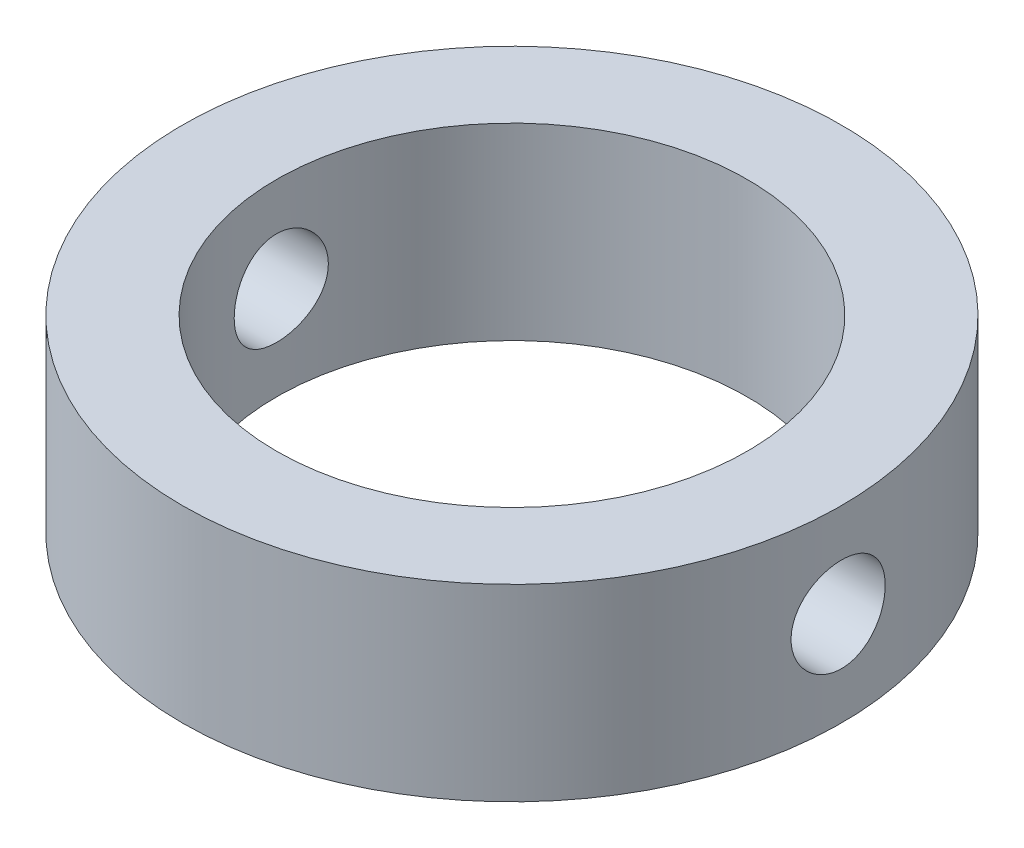
ISO-10303-21;
HEADER;
FILE_DESCRIPTION(('STEP AP214'),'2;1');
FILE_NAME('part.step','',(''),(''),'','','');
FILE_SCHEMA(('AUTOMOTIVE_DESIGN { 1 0 10303 214 1 1 1 1 }'));
ENDSEC;
DATA;
#1=APPLICATION_CONTEXT('core data for automotive mechanical design processes');
#2=APPLICATION_PROTOCOL_DEFINITION('international standard','automotive_design',2000,#1);
#3=PRODUCT_CONTEXT('',#1,'mechanical');
#4=PRODUCT('Part','Part','',(#3));
#5=PRODUCT_RELATED_PRODUCT_CATEGORY('part','',(#4));
#6=PRODUCT_DEFINITION_FORMATION('','',#4);
#7=PRODUCT_DEFINITION_CONTEXT('part definition',#1,'design');
#8=PRODUCT_DEFINITION('design','',#6,#7);
#9=PRODUCT_DEFINITION_SHAPE('','',#8);
#10=(LENGTH_UNIT() NAMED_UNIT(*) SI_UNIT(.MILLI.,.METRE.));
#11=(NAMED_UNIT(*) PLANE_ANGLE_UNIT() SI_UNIT($,.RADIAN.));
#12=(NAMED_UNIT(*) SI_UNIT($,.STERADIAN.) SOLID_ANGLE_UNIT());
#13=UNCERTAINTY_MEASURE_WITH_UNIT(LENGTH_MEASURE(1.E-05),#10,'distance_accuracy_value','');
#14=(GEOMETRIC_REPRESENTATION_CONTEXT(3) GLOBAL_UNCERTAINTY_ASSIGNED_CONTEXT((#13)) GLOBAL_UNIT_ASSIGNED_CONTEXT((#10,
#11,#12)) REPRESENTATION_CONTEXT('',''));
#15=CARTESIAN_POINT('',(0.,0.,0.));
#16=DIRECTION('',(0.,0.,1.));
#17=DIRECTION('',(1.,0.,0.));
#18=AXIS2_PLACEMENT_3D('',#15,#16,#17);
#19=CARTESIAN_POINT('',(0.,20.,0.));
#20=DIRECTION('',(0.,1.,0.));
#21=DIRECTION('',(0.,0.,1.));
#22=AXIS2_PLACEMENT_3D('',#19,#20,#21);
#23=PLANE('',#22);
#24=CARTESIAN_POINT('',(0.,20.,0.));
#25=DIRECTION('',(0.,1.,0.));
#26=DIRECTION('',(0.,0.,1.));
#27=AXIS2_PLACEMENT_3D('',#24,#25,#26);
#28=CIRCLE('',#27,35.);
#29=CARTESIAN_POINT('',(0.,20.,35.));
#30=VERTEX_POINT('',#29);
#31=EDGE_CURVE('E12',#30,#30,#28,.T.);
#32=ORIENTED_EDGE('',*,*,#31,.T.);
#33=EDGE_LOOP('',(#32));
#34=FACE_BOUND('',#33,.T.);
#35=CARTESIAN_POINT('',(0.,20.,0.));
#36=DIRECTION('',(0.,1.,0.));
#37=DIRECTION('',(0.,0.,1.));
#38=AXIS2_PLACEMENT_3D('',#35,#36,#37);
#39=CIRCLE('',#38,25.);
#40=CARTESIAN_POINT('',(0.,20.,25.));
#41=VERTEX_POINT('',#40);
#42=EDGE_CURVE('E62',#41,#41,#39,.T.);
#43=ORIENTED_EDGE('',*,*,#42,.F.);
#44=EDGE_LOOP('',(#43));
#45=FACE_BOUND('',#44,.T.);
#46=ADVANCED_FACE('F44',(#34,#45),#23,.T.);
#47=CARTESIAN_POINT('',(0.,0.,0.));
#48=DIRECTION('',(0.,1.,0.));
#49=DIRECTION('',(0.,0.,1.));
#50=AXIS2_PLACEMENT_3D('',#47,#48,#49);
#51=PLANE('',#50);
#52=CARTESIAN_POINT('',(0.,0.,0.));
#53=DIRECTION('',(0.,1.,0.));
#54=DIRECTION('',(0.,0.,1.));
#55=AXIS2_PLACEMENT_3D('',#52,#53,#54);
#56=CIRCLE('',#55,35.);
#57=CARTESIAN_POINT('',(0.,0.,35.));
#58=VERTEX_POINT('',#57);
#59=EDGE_CURVE('E57',#58,#58,#56,.T.);
#60=ORIENTED_EDGE('',*,*,#59,.F.);
#61=EDGE_LOOP('',(#60));
#62=FACE_BOUND('',#61,.T.);
#63=CARTESIAN_POINT('',(0.,0.,0.));
#64=DIRECTION('',(0.,1.,0.));
#65=DIRECTION('',(0.,0.,1.));
#66=AXIS2_PLACEMENT_3D('',#63,#64,#65);
#67=CIRCLE('',#66,25.);
#68=CARTESIAN_POINT('',(0.,0.,25.));
#69=VERTEX_POINT('',#68);
#70=EDGE_CURVE('E65',#69,#69,#67,.T.);
#71=ORIENTED_EDGE('',*,*,#70,.T.);
#72=EDGE_LOOP('',(#71));
#73=FACE_BOUND('',#72,.T.);
#74=ADVANCED_FACE('F98',(#62,#73),#51,.F.);
#75=CARTESIAN_POINT('',(0.,20.,0.));
#76=DIRECTION('',(0.,-1.,0.));
#77=DIRECTION('',(0.,0.,-1.));
#78=AXIS2_PLACEMENT_3D('',#75,#76,#77);
#79=CYLINDRICAL_SURFACE('',#78,35.);
#80=CARTESIAN_POINT('',(-35.,5.,0.));
#81=CARTESIAN_POINT('',(-35.0000006860778,4.99999818929188,-0.139711965235696));
#82=CARTESIAN_POINT('',(-34.999161843125,5.0058578151773,-0.279398196753226));
#83=CARTESIAN_POINT('',(-34.9958313784779,5.02925000801078,-0.557813784721073));
#84=CARTESIAN_POINT('',(-34.9933394007628,5.04678508940111,-0.696542928547854));
#85=CARTESIAN_POINT('',(-34.9867693707623,5.0934165531225,-0.972102139757613));
#86=CARTESIAN_POINT('',(-34.9826902085511,5.12252102629568,-1.10893080862606));
#87=CARTESIAN_POINT('',(-34.9730590791279,5.19208489808497,-1.37967153042048));
#88=CARTESIAN_POINT('',(-34.967506572113,5.23254845875035,-1.51358249486203));
#89=CARTESIAN_POINT('',(-34.9550920980501,5.32447506158359,-1.7773437010832));
#90=CARTESIAN_POINT('',(-34.9482315879302,5.37592587311224,-1.90719827555243));
#91=CARTESIAN_POINT('',(-34.9333858561535,5.4894993365725,-2.16214361261762));
#92=CARTESIAN_POINT('',(-34.9254002203592,5.55162591991152,-2.28723259945559));
#93=CARTESIAN_POINT('',(-34.9085328812956,5.68605632465839,-2.53166639908102));
#94=CARTESIAN_POINT('',(-34.8996516526061,5.75835476388654,-2.65101420514071));
#95=CARTESIAN_POINT('',(-34.8812325486413,5.91267171554836,-2.88326082385479));
#96=CARTESIAN_POINT('',(-34.8716944304009,5.99469383267839,-2.99615722175638));
#97=CARTESIAN_POINT('',(-34.8521704775311,6.1683847096467,-3.21533718478548));
#98=CARTESIAN_POINT('',(-34.8421823026048,6.2601083282132,-3.3215770714854));
#99=CARTESIAN_POINT('',(-34.8220884461062,6.45218840203753,-3.52600506054429));
#100=CARTESIAN_POINT('',(-34.8119827224244,6.55254803883758,-3.62419016924665));
#101=CARTESIAN_POINT('',(-34.7919447938239,6.76114314216352,-3.81175458438146));
#102=CARTESIAN_POINT('',(-34.7820125357508,6.86937614164711,-3.90113662868194));
#103=CARTESIAN_POINT('',(-34.7625949602833,7.09303892925481,-4.07053623382577));
#104=CARTESIAN_POINT('',(-34.7531098091014,7.20847135730178,-4.15055032826988));
#105=CARTESIAN_POINT('',(-34.7348222414193,7.4461847947123,-4.30091696829763));
#106=CARTESIAN_POINT('',(-34.7260227770465,7.56849189214748,-4.37122864509177));
#107=CARTESIAN_POINT('',(-34.7094000721106,7.81870567941545,-4.50131629768271));
#108=CARTESIAN_POINT('',(-34.7015771956237,7.94661443370769,-4.56108834766626));
#109=CARTESIAN_POINT('',(-34.6871419356038,8.20704411166183,-4.66960271135163));
#110=CARTESIAN_POINT('',(-34.6805290584372,8.33956312813478,-4.7183495248549));
#111=CARTESIAN_POINT('',(-34.6686991206471,8.60831481028371,-4.80449411280179));
#112=CARTESIAN_POINT('',(-34.6634825715625,8.74454881684625,-4.84188772872159));
#113=CARTESIAN_POINT('',(-34.6502412093486,9.15539122224089,-4.93609300727224));
#114=CARTESIAN_POINT('',(-34.6445057193659,9.43422105377913,-4.97579308637068));
#115=CARTESIAN_POINT('',(-34.6398819492284,9.99448707081467,-5.00787485589865));
#116=CARTESIAN_POINT('',(-34.6409933119183,10.275923119598,-5.0002590144896));
#117=CARTESIAN_POINT('',(-34.6498870154908,10.8313714520891,-4.9382471005116));
#118=CARTESIAN_POINT('',(-34.6576192499146,11.1054235888147,-4.88420238946514));
#119=CARTESIAN_POINT('',(-34.6788083896617,11.6405184529141,-4.73139963561513));
#120=CARTESIAN_POINT('',(-34.692265443089,11.9015608435235,-4.63264043601932));
#121=CARTESIAN_POINT('',(-34.723442939239,12.404315551672,-4.39284733162306));
#122=CARTESIAN_POINT('',(-34.741178468128,12.645955343782,-4.25166339197206));
#123=CARTESIAN_POINT('',(-34.7789036804371,13.1022462791065,-3.93113430221592));
#124=CARTESIAN_POINT('',(-34.798893498191,13.3168958123487,-3.75178687737028));
#125=CARTESIAN_POINT('',(-34.8390967878415,13.7151519563424,-3.35808727358497));
#126=CARTESIAN_POINT('',(-34.8593106452498,13.8984597094344,-3.14343268253193));
#127=CARTESIAN_POINT('',(-34.8975158937566,14.2264925219817,-2.68624580236059));
#128=CARTESIAN_POINT('',(-34.9155072766877,14.3712174396505,-2.44371341079993));
#129=CARTESIAN_POINT('',(-34.9472567659471,14.6179871832637,-1.93740519763101));
#130=CARTESIAN_POINT('',(-34.9610127153715,14.7200102726818,-1.67361863827555));
#131=CARTESIAN_POINT('',(-34.9827229972304,14.8782273476525,-1.13241674727819));
#132=CARTESIAN_POINT('',(-34.9906776850993,14.9344241409372,-0.855002251710928));
#133=CARTESIAN_POINT('',(-34.9998423643269,14.9989990670683,-0.297000055843298));
#134=CARTESIAN_POINT('',(-35.0011103405764,15.0077883172752,-0.0164608487179037));
#135=CARTESIAN_POINT('',(-34.9969161817281,14.9783879788458,0.542087125645167));
#136=CARTESIAN_POINT('',(-34.9914542350836,14.9401997056888,0.820095963519429));
#137=CARTESIAN_POINT('',(-34.9744498431576,14.8182701503926,1.3644560453801));
#138=CARTESIAN_POINT('',(-34.9629339676888,14.7347278684361,1.63085276383533));
#139=CARTESIAN_POINT('',(-34.9351093573742,14.5246706353757,2.14585735852662));
#140=CARTESIAN_POINT('',(-34.9188004158195,14.3981538308876,2.39446446698114));
#141=CARTESIAN_POINT('',(-34.8830594271557,14.104765519102,2.8686492452542));
#142=CARTESIAN_POINT('',(-34.8636073633022,13.9376316562326,3.09406305330408));
#143=CARTESIAN_POINT('',(-34.8238111686978,13.568119579361,3.51378821545187));
#144=CARTESIAN_POINT('',(-34.8034669912002,13.3657395168079,3.70809793721321));
#145=CARTESIAN_POINT('',(-34.7639969744239,12.9296591145285,4.06158419660657));
#146=CARTESIAN_POINT('',(-34.744881427038,12.6957350710407,4.22048605580271));
#147=CARTESIAN_POINT('',(-34.7102118986922,12.2042637867791,4.49673891517369));
#148=CARTESIAN_POINT('',(-34.6946578287042,11.9467171367361,4.6140909540289));
#149=CARTESIAN_POINT('',(-34.6689438410495,11.4162038186821,4.80348639883543));
#150=CARTESIAN_POINT('',(-34.6587663611732,11.1432906178735,4.87567746367888));
#151=CARTESIAN_POINT('',(-34.6449167798224,10.5889035851804,4.97315511988575));
#152=CARTESIAN_POINT('',(-34.6412442742826,10.3074302861229,4.99844462460795));
#153=CARTESIAN_POINT('',(-34.6409177443896,9.88660340048782,5.00066933047666));
#154=CARTESIAN_POINT('',(-34.6416592306475,9.74712233687898,4.99555150672416));
#155=CARTESIAN_POINT('',(-34.6448062249864,9.46910768196229,4.97368641015655));
#156=CARTESIAN_POINT('',(-34.64721111119,9.33057375609876,4.95694348348537));
#157=CARTESIAN_POINT('',(-34.6536195165195,9.05538610632109,4.91194067050613));
#158=CARTESIAN_POINT('',(-34.6576236130464,8.91873307996746,4.88367662437867));
#159=CARTESIAN_POINT('',(-34.6671124474975,8.64836127716213,4.81585790764448));
#160=CARTESIAN_POINT('',(-34.6725966491112,8.51464145681404,4.77630732637378));
#161=CARTESIAN_POINT('',(-34.6848879936517,8.25106171539306,4.68621474918535));
#162=CARTESIAN_POINT('',(-34.6916947799399,8.12120076462486,4.6356757158975));
#163=CARTESIAN_POINT('',(-34.706436093274,7.86624784074538,4.52398755892089));
#164=CARTESIAN_POINT('',(-34.7143702129374,7.74115416551156,4.46284226624334));
#165=CARTESIAN_POINT('',(-34.7311475419236,7.49650017972462,4.33034054019654));
#166=CARTESIAN_POINT('',(-34.7399910934,7.37694197648466,4.2589802596769));
#167=CARTESIAN_POINT('',(-34.7583336850593,7.14426737133224,4.1065952131632));
#168=CARTESIAN_POINT('',(-34.7678324910584,7.03114869408639,4.02557389249735));
#169=CARTESIAN_POINT('',(-34.7873123719355,6.81107752456893,3.853628075488));
#170=CARTESIAN_POINT('',(-34.7972970484689,6.70419050143055,3.76262018038959));
#171=CARTESIAN_POINT('',(-34.8173823591155,6.49848730385439,3.57198348876703));
#172=CARTESIAN_POINT('',(-34.8274829501354,6.39966823422946,3.47235781140242));
#173=CARTESIAN_POINT('',(-34.8475259991844,6.21068548934781,3.2650844270276));
#174=CARTESIAN_POINT('',(-34.8574683585998,6.12052704793255,3.15743193813457));
#175=CARTESIAN_POINT('',(-34.8769059739469,5.94959504947742,2.93494333367632));
#176=CARTESIAN_POINT('',(-34.8864013936703,5.86881803821249,2.82010988623894));
#177=CARTESIAN_POINT('',(-34.9047316512703,5.71677456207878,2.58338423045614));
#178=CARTESIAN_POINT('',(-34.9135626772856,5.64556137187799,2.46145749893787));
#179=CARTESIAN_POINT('',(-34.9302535606849,5.51369959328609,2.21201372916546));
#180=CARTESIAN_POINT('',(-34.9381137745068,5.45304712410902,2.08449876609138));
#181=CARTESIAN_POINT('',(-34.9526376335039,5.34276185965578,1.82483209134307));
#182=CARTESIAN_POINT('',(-34.9593021712943,5.29312083733788,1.69268392736855));
#183=CARTESIAN_POINT('',(-34.9712506726184,5.20518346886345,1.42465130322803));
#184=CARTESIAN_POINT('',(-34.9765349502521,5.1668845413667,1.28876770091337));
#185=CARTESIAN_POINT('',(-34.9872530233497,5.08982078578532,0.963108594661556));
#186=CARTESIAN_POINT('',(-34.9920122459541,5.05617470132987,0.772076120040924));
#187=CARTESIAN_POINT('',(-34.9983852418966,5.01126568365557,0.387345931764564));
#188=CARTESIAN_POINT('',(-34.9999990490595,5.00000250973818,0.193648246792198));
#189=CARTESIAN_POINT('',(-35.,5.,0.));
#190=B_SPLINE_CURVE_WITH_KNOTS('',3,(#80,#81,#82,#83,#84,#85,#86,#87,#88,#89,#90,#91,#92,#93,
#94,#95,#96,#97,#98,#99,#100,#101,#102,#103,#104,#105,#106,#107,#108,#109,#110,#111,#112,#113,
#114,#115,#116,#117,#118,#119,#120,#121,#122,#123,#124,#125,#126,#127,#128,#129,#130,#131,#132,
#133,#134,#135,#136,#137,#138,#139,#140,#141,#142,#143,#144,#145,#146,#147,#148,#149,#150,#151,
#152,#153,#154,#155,#156,#157,#158,#159,#160,#161,#162,#163,#164,#165,#166,#167,#168,#169,#170,
#171,#172,#173,#174,#175,#176,#177,#178,#179,#180,#181,#182,#183,#184,#185,#186,#187,#188,#189),
.UNSPECIFIED.,.T.,.F.,(4,2,2,2,2,2,2,2,2,2,2,2,2,2,2,2,2,2,2,2,2,2,2,2,2,2,2,2,2,2,2,2,2,2,2,2,
2,2,2,2,2,2,2,2,2,2,2,2,2,2,2,2,2,2,4),(0.,0.418966329009693,0.838022916385254,1.2573730803352,
1.67687709812696,2.09591654992399,2.51511064713488,2.93408376681293,3.35321269395622,
3.77485308867608,4.19664948786084,4.61831428582347,5.04013462151232,5.4636807981665,
5.88738440608966,6.31091477178938,6.73460008433589,7.57528830735183,8.41593267754194,
9.250270755796,10.0846304201402,10.9219762318504,11.7593719676762,12.6043542589704,
13.4493396554145,14.2947546534945,15.1401178499342,15.9781381434551,16.8161349710045,
17.6504842847265,18.4848695864277,19.3247947409687,20.1647639601821,21.0110384594203,
21.8572918016286,22.7007635598242,23.5441829227868,23.9625062017856,24.3806731712067,
24.7989912580644,25.2171579719813,25.6352120821983,26.0531155033245,26.471176730616,
26.8890893119641,27.3108043638925,27.7323674119563,28.1541836395221,28.5758440594237,
28.9997636627364,29.4235271565091,29.8469729671238,30.2703223317802,30.8510382885208,
31.4317480003971),.UNSPECIFIED.);
#191=CARTESIAN_POINT('',(-35.,5.,0.));
#192=VERTEX_POINT('',#191);
#193=EDGE_CURVE('E88',#192,#192,#190,.T.);
#194=ORIENTED_EDGE('',*,*,#193,.T.);
#195=EDGE_LOOP('',(#194));
#196=FACE_BOUND('',#195,.T.);
#197=CARTESIAN_POINT('',(34.6410161513775,10.,-5.));
#198=CARTESIAN_POINT('',(34.6410154391642,9.86029621593461,-5.0000018122471));
#199=CARTESIAN_POINT('',(34.6418629518526,9.72061816560545,-4.99414286579146));
#200=CARTESIAN_POINT('',(34.6452270530683,9.44221916074251,-4.97075345355146));
#201=CARTESIAN_POINT('',(34.6477440012829,9.30349841897435,-4.95322047254227));
#202=CARTESIAN_POINT('',(34.6543774935575,9.02795619534776,-4.90659475442792));
#203=CARTESIAN_POINT('',(34.658495158733,8.89113611439661,-4.87749391506493));
#204=CARTESIAN_POINT('',(34.6682124585494,8.62041275043951,-4.80793901020266));
#205=CARTESIAN_POINT('',(34.6738126365657,8.48651055642308,-4.76748078162647));
#206=CARTESIAN_POINT('',(34.6863261144397,8.22276800682994,-4.67556705521208));
#207=CARTESIAN_POINT('',(34.693237940152,8.09292328010976,-4.62412389515699));
#208=CARTESIAN_POINT('',(34.7081843179821,7.83799679273783,-4.51056759110167));
#209=CARTESIAN_POINT('',(34.7162192835375,7.71291680770337,-4.448450516));
#210=CARTESIAN_POINT('',(34.733177760152,7.46849940424351,-4.31404058429293));
#211=CARTESIAN_POINT('',(34.7421008013996,7.34915899849939,-4.24175309977212));
#212=CARTESIAN_POINT('',(34.7605914102924,7.11692514782452,-4.08745906749016));
#213=CARTESIAN_POINT('',(34.7701592164031,7.00403411702642,-4.00544891520445));
#214=CARTESIAN_POINT('',(34.7897286484028,6.78484680165324,-3.83177001037932));
#215=CARTESIAN_POINT('',(34.7997325759272,6.67859523157637,-3.74004508176633));
#216=CARTESIAN_POINT('',(34.8198407002969,6.47414377106637,-3.54795991527328));
#217=CARTESIAN_POINT('',(34.8299449328735,6.37594687439006,-3.44759649479162));
#218=CARTESIAN_POINT('',(34.8499627971442,6.18835939815263,-3.23899148365546));
#219=CARTESIAN_POINT('',(34.8598764876709,6.09896606403691,-3.13075237578169));
#220=CARTESIAN_POINT('',(34.8792419453894,5.92954475122299,-2.90707506299795));
#221=CARTESIAN_POINT('',(34.8886935408841,5.84952023845382,-2.79163421791335));
#222=CARTESIAN_POINT('',(34.9069016885813,5.69914178767811,-2.55391409389059));
#223=CARTESIAN_POINT('',(34.9156553170766,5.62882770945121,-2.43160936732319));
#224=CARTESIAN_POINT('',(34.9321803214305,5.49873500510364,-2.18140012986931));
#225=CARTESIAN_POINT('',(34.9399513309909,5.43896030457051,-2.05349355452121));
#226=CARTESIAN_POINT('',(34.9542827788644,5.33044048525349,-1.79306831729175));
#227=CARTESIAN_POINT('',(34.9608437094765,5.28169087927316,-1.66055155717825));
#228=CARTESIAN_POINT('',(34.9725754856837,5.19554059966432,-1.39180486373783));
#229=CARTESIAN_POINT('',(34.9777458217154,5.15814408556814,-1.25557358936556));
#230=CARTESIAN_POINT('',(34.9908661236587,5.06393058770107,-0.844743976273194));
#231=CARTESIAN_POINT('',(34.9965435452706,5.02422418470374,-0.565925356335791));
#232=CARTESIAN_POINT('',(35.0011225996405,4.99212589469167,-0.00568137169031964));
#233=CARTESIAN_POINT('',(35.0000245756701,4.99973161065258,0.275743860234861));
#234=CARTESIAN_POINT('',(34.9912220174932,5.06172725204327,0.831236202825561));
#235=CARTESIAN_POINT('',(34.983565660607,5.11577601728604,1.1053419772077));
#236=CARTESIAN_POINT('',(34.9625573280242,5.26860537914401,1.64054201011344));
#237=CARTESIAN_POINT('',(34.9492052169871,5.36738703868964,1.90163595929007));
#238=CARTESIAN_POINT('',(34.918223457376,5.60722713668461,2.40445410298171));
#239=CARTESIAN_POINT('',(34.9005791903821,5.7484304514335,2.64610826381351));
#240=CARTESIAN_POINT('',(34.8629816813172,6.06900115820985,3.10241976852131));
#241=CARTESIAN_POINT('',(34.8430283012416,6.24837083179455,3.31707549722949));
#242=CARTESIAN_POINT('',(34.8028301198188,6.64208652418025,3.715307418436));
#243=CARTESIAN_POINT('',(34.782584306769,6.85673033723001,3.89858921744104));
#244=CARTESIAN_POINT('',(34.7442573479033,7.31388629821665,4.22657475561672));
#245=CARTESIAN_POINT('',(34.7261762131781,7.5563985889262,4.37127829713491));
#246=CARTESIAN_POINT('',(34.6942263418025,8.06270072620422,4.61803253378663));
#247=CARTESIAN_POINT('',(34.6803603941768,8.32650451509937,4.7200550052405));
#248=CARTESIAN_POINT('',(34.6584616452935,8.86774394917187,4.8782655937619));
#249=CARTESIAN_POINT('',(34.6504284729119,9.14517872584617,4.93445662699028));
#250=CARTESIAN_POINT('',(34.6411745189243,9.70319134370666,4.99900976722198));
#251=CARTESIAN_POINT('',(34.6398944301118,9.98372006512692,5.00778827871545));
#252=CARTESIAN_POINT('',(34.6441343132837,10.5422445124249,4.97837020507439));
#253=CARTESIAN_POINT('',(34.6496540945125,10.8202403091379,4.94017493768696));
#254=CARTESIAN_POINT('',(34.6668174132737,11.3645304504895,4.81824595075754));
#255=CARTESIAN_POINT('',(34.6784332841747,11.6308718191964,4.73471791248743));
#256=CARTESIAN_POINT('',(34.7064572797608,12.1457719921081,4.52470763790893));
#257=CARTESIAN_POINT('',(34.7228656207111,12.39432999319,4.39822346311933));
#258=CARTESIAN_POINT('',(34.7587662123785,12.8684797050572,4.10488406983362));
#259=CARTESIAN_POINT('',(34.778278818957,13.0939024245694,3.93775823113058));
#260=CARTESIAN_POINT('',(34.8181272639984,13.5136492875241,3.56825671506987));
#261=CARTESIAN_POINT('',(34.838463144517,13.7079718397411,3.36587923518415));
#262=CARTESIAN_POINT('',(34.8778513391193,14.061488127096,2.92979358250642));
#263=CARTESIAN_POINT('',(34.8968928467999,14.2204066091989,2.69586117657925));
#264=CARTESIAN_POINT('',(34.9313804312442,14.4966886044469,2.20436851574153));
#265=CARTESIAN_POINT('',(34.9468265987843,14.614053166798,1.94680885760851));
#266=CARTESIAN_POINT('',(34.9723373469684,14.8034564144772,1.41630188802804));
#267=CARTESIAN_POINT('',(34.9824200851104,14.8756481773004,1.14340999758269));
#268=CARTESIAN_POINT('',(34.9961374843224,14.9731344622857,0.589068150525993));
#269=CARTESIAN_POINT('',(34.9997725300055,14.9984317817665,0.307618705402688));
#270=CARTESIAN_POINT('',(35.0000980196249,15.0006741950208,-0.113202683468905));
#271=CARTESIAN_POINT('',(34.9993649007347,14.9955609197834,-0.252701211609328));
#272=CARTESIAN_POINT('',(34.9962506918872,14.9737019499812,-0.530751314232243));
#273=CARTESIAN_POINT('',(34.9938702177269,14.9569606020903,-0.669303223032244));
#274=CARTESIAN_POINT('',(34.9875241065998,14.9119578577426,-0.944527140960388));
#275=CARTESIAN_POINT('',(34.983557898768,14.8836923124948,-1.08119845472437));
#276=CARTESIAN_POINT('',(34.9741540277206,14.8158673676576,-1.35160692511811));
#277=CARTESIAN_POINT('',(34.9687168977989,14.7763120609714,-1.48534512620926));
#278=CARTESIAN_POINT('',(34.956523509257,14.6862058907079,-1.74896376669509));
#279=CARTESIAN_POINT('',(34.9497675805569,14.6356577768109,-1.87884516159298));
#280=CARTESIAN_POINT('',(34.9351261885931,14.5239479530626,-2.13383759136382));
#281=CARTESIAN_POINT('',(34.9272411335341,14.4627900771986,-2.25895032960641));
#282=CARTESIAN_POINT('',(34.9105547366064,14.33026013122,-2.50364014566413));
#283=CARTESIAN_POINT('',(34.9017530506831,14.2588842220048,-2.62321512039114));
#284=CARTESIAN_POINT('',(34.8834823136215,14.1064654331607,-2.8559203177104));
#285=CARTESIAN_POINT('',(34.8740135009923,14.0254260012999,-2.96905281770032));
#286=CARTESIAN_POINT('',(34.8545807366046,13.8534606507464,-3.18912439994284));
#287=CARTESIAN_POINT('',(34.8446131343377,13.7624533218239,-3.29599955535524));
#288=CARTESIAN_POINT('',(34.8245448080178,13.5718202208643,-3.50167884270045));
#289=CARTESIAN_POINT('',(34.814444133241,13.4721975670114,-3.60048586980278));
#290=CARTESIAN_POINT('',(34.7943837777507,13.2649326186417,-3.789444905816));
#291=CARTESIAN_POINT('',(34.7844241856026,13.157285531044,-3.87959166708624));
#292=CARTESIAN_POINT('',(34.7649369098833,12.9348100683732,-4.05050109467335));
#293=CARTESIAN_POINT('',(34.7554090682198,12.8199843591218,-4.13126721307556));
#294=CARTESIAN_POINT('',(34.7370013113202,12.5832647311211,-4.28329753184929));
#295=CARTESIAN_POINT('',(34.7281252136464,12.4613356752274,-4.35450750137419));
#296=CARTESIAN_POINT('',(34.7113377418939,12.2118875758864,-4.48636261684556));
#297=CARTESIAN_POINT('',(34.7034260137396,12.084370607603,-4.54701164384714));
#298=CARTESIAN_POINT('',(34.6887985721337,11.8246999976521,-4.65728990592972));
#299=CARTESIAN_POINT('',(34.6820819648177,11.6925499105332,-4.70692738377103));
#300=CARTESIAN_POINT('',(34.670034668512,11.4245130526235,-4.79485763175049));
#301=CARTESIAN_POINT('',(34.6647036638671,11.2886271407075,-4.83315298602431));
#302=CARTESIAN_POINT('',(34.6538884329244,10.9629890903312,-4.91020164286521));
#303=CARTESIAN_POINT('',(34.6490831060692,10.771980525803,-4.94383927658103));
#304=CARTESIAN_POINT('',(34.642647476579,10.387298143718,-4.98873707431739));
#305=CARTESIAN_POINT('',(34.6410171384792,10.193624355956,-4.99999748829154));
#306=CARTESIAN_POINT('',(34.6410161513775,10.,-5.));
#307=B_SPLINE_CURVE_WITH_KNOTS('',3,(#197,#198,#199,#200,#201,#202,#203,#204,#205,#206,#207,
#208,#209,#210,#211,#212,#213,#214,#215,#216,#217,#218,#219,#220,#221,#222,#223,#224,#225,#226,
#227,#228,#229,#230,#231,#232,#233,#234,#235,#236,#237,#238,#239,#240,#241,#242,#243,#244,#245,
#246,#247,#248,#249,#250,#251,#252,#253,#254,#255,#256,#257,#258,#259,#260,#261,#262,#263,#264,
#265,#266,#267,#268,#269,#270,#271,#272,#273,#274,#275,#276,#277,#278,#279,#280,#281,#282,#283,
#284,#285,#286,#287,#288,#289,#290,#291,#292,#293,#294,#295,#296,#297,#298,#299,#300,#301,#302,
#303,#304,#305,#306),.UNSPECIFIED.,.T.,.F.,(4,2,2,2,2,2,2,2,2,2,2,2,2,2,2,2,2,2,2,2,2,2,2,2,2,2,
2,2,2,2,2,2,2,2,2,2,2,2,2,2,2,2,2,2,2,2,2,2,2,2,2,2,2,2,4),(0.,0.418941757697895,
0.837973807559074,1.25729987077408,1.676779840068,2.09579112334161,2.51495705653461,
2.93390240869216,3.35300356675528,3.77467626293622,4.19650498265651,4.61820129384828,
5.04005311891656,5.46358814046364,5.88728058379115,6.31080027336864,6.73447494484351,
7.57513090903345,8.41574428252049,9.25023497825405,10.0847455039608,10.9221390466027,
11.759582662094,12.6044983052241,13.4494182771249,14.2948960888448,15.1403201003399,
15.978306882632,16.8162701575656,17.6504628756755,18.4846932433961,19.3246383808546,
20.164626479983,21.0109333936222,21.8572189371095,22.7006209090407,23.5439725692556,
23.9623475710554,24.3805662647757,24.7989356532617,25.2171535615622,25.6352669792153,
26.0532296192162,26.4713497095274,26.8893210660889,27.3110044309822,27.7325358077672,
28.1543210190645,28.5759505178875,28.9998797832738,29.4236529280186,29.847107776373,
30.2704660724344,30.8511105743425,31.4317485904134),.UNSPECIFIED.);
#308=CARTESIAN_POINT('',(34.6410161513775,10.,-5.));
#309=VERTEX_POINT('',#308);
#310=EDGE_CURVE('E84',#309,#309,#307,.T.);
#311=ORIENTED_EDGE('',*,*,#310,.T.);
#312=EDGE_LOOP('',(#311));
#313=FACE_BOUND('',#312,.T.);
#314=ORIENTED_EDGE('',*,*,#31,.F.);
#315=EDGE_LOOP('',(#314));
#316=FACE_BOUND('',#315,.T.);
#317=ORIENTED_EDGE('',*,*,#59,.T.);
#318=EDGE_LOOP('',(#317));
#319=FACE_BOUND('',#318,.T.);
#320=ADVANCED_FACE('F46',(#196,#313,#316,#319),#79,.T.);
#321=CARTESIAN_POINT('',(0.,20.,0.));
#322=DIRECTION('',(0.,-1.,0.));
#323=DIRECTION('',(0.,0.,-1.));
#324=AXIS2_PLACEMENT_3D('',#321,#322,#323);
#325=CYLINDRICAL_SURFACE('',#324,25.);
#326=CARTESIAN_POINT('',(-24.4948974278318,10.,-5.));
#327=CARTESIAN_POINT('',(-24.4948959140652,10.1389562284322,-5.00000277932283));
#328=CARTESIAN_POINT('',(-24.4960820445244,10.277877759427,-4.99420583952395));
#329=CARTESIAN_POINT('',(-24.5007881327193,10.5547609107824,-4.97106951247274));
#330=CARTESIAN_POINT('',(-24.5043085313918,10.692722344807,-4.95372794446977));
#331=CARTESIAN_POINT('',(-24.5135833999899,10.9667141290813,-4.90762442723258));
#332=CARTESIAN_POINT('',(-24.5193390123237,11.1027434549275,-4.8788566379347));
#333=CARTESIAN_POINT('',(-24.5329168521693,11.3718889208066,-4.8101161975473));
#334=CARTESIAN_POINT('',(-24.5407398404404,11.5050039688689,-4.77013942141009));
#335=CARTESIAN_POINT('',(-24.5582115919251,11.7671561405252,-4.679356239882));
#336=CARTESIAN_POINT('',(-24.5678578195523,11.8961986403977,-4.62856486213672));
#337=CARTESIAN_POINT('',(-24.5887102826167,12.1495630412791,-4.51647818958425));
#338=CARTESIAN_POINT('',(-24.5999170932378,12.2738831801666,-4.45517901998884));
#339=CARTESIAN_POINT('',(-24.6235656382957,12.5168633390302,-4.32256259117468));
#340=CARTESIAN_POINT('',(-24.6360068230559,12.6355258438509,-4.25124978528394));
#341=CARTESIAN_POINT('',(-24.6617859698465,12.8665078033123,-4.09905714012307));
#342=CARTESIAN_POINT('',(-24.6751242659164,12.9788248662625,-4.0181737286281));
#343=CARTESIAN_POINT('',(-24.7024933301151,13.1976726271486,-3.84635941756609));
#344=CARTESIAN_POINT('',(-24.7165306060046,13.3041149652436,-3.7553169869603));
#345=CARTESIAN_POINT('',(-24.7447550172108,13.5090176111652,-3.56460271884441));
#346=CARTESIAN_POINT('',(-24.7589422061409,13.6074749460279,-3.46492769556318));
#347=CARTESIAN_POINT('',(-24.7870621737417,13.7956696544435,-3.25767968751707));
#348=CARTESIAN_POINT('',(-24.80099502638,13.885409597144,-3.15010904621878));
#349=CARTESIAN_POINT('',(-24.8282290266689,14.0556155324462,-2.92772937682517));
#350=CARTESIAN_POINT('',(-24.8415299396397,14.1360780953441,-2.81291769594009));
#351=CARTESIAN_POINT('',(-24.867232331661,14.2877599293321,-2.57586269555549));
#352=CARTESIAN_POINT('',(-24.8796253494226,14.3588961857274,-2.45356521066842));
#353=CARTESIAN_POINT('',(-24.9030409030999,14.4906156197631,-2.20327286170085));
#354=CARTESIAN_POINT('',(-24.9140629244939,14.5511948388487,-2.0752758829805));
#355=CARTESIAN_POINT('',(-24.9445697433125,14.7162935264673,-1.68417147036292));
#356=CARTESIAN_POINT('',(-24.9615274484324,14.8043568478153,-1.41366454176391));
#357=CARTESIAN_POINT('',(-24.9865205281948,14.9325572950363,-0.865044260538021));
#358=CARTESIAN_POINT('',(-24.9946705178815,14.9733105994109,-0.587078089251459));
#359=CARTESIAN_POINT('',(-25.001544855821,15.0077490481861,-0.0281034479881222));
#360=CARTESIAN_POINT('',(-25.0002701123409,15.0014387281359,0.252904726222843));
#361=CARTESIAN_POINT('',(-24.9885220591615,14.9423705973681,0.805712786453447));
#362=CARTESIAN_POINT('',(-24.9781800029126,14.8902755157609,1.07758681729645));
#363=CARTESIAN_POINT('',(-24.9496087733464,14.7421744360893,1.60865738706756));
#364=CARTESIAN_POINT('',(-24.93137928446,14.6461666811094,1.86785341829837));
#365=CARTESIAN_POINT('',(-24.8888648238832,14.4123499078751,2.36809751770485));
#366=CARTESIAN_POINT('',(-24.8645424148967,14.2742812735962,2.60902092474939));
#367=CARTESIAN_POINT('',(-24.812523467553,13.960454584693,3.06452517521266));
#368=CARTESIAN_POINT('',(-24.7848265411053,13.7846921932812,3.27910298301492));
#369=CARTESIAN_POINT('',(-24.7285482199077,13.396831897461,3.67975717013202));
#370=CARTESIAN_POINT('',(-24.6999598233212,13.1841540684962,3.86527158685728));
#371=CARTESIAN_POINT('',(-24.6455785794926,12.730417785602,4.19809246189484));
#372=CARTESIAN_POINT('',(-24.6197857851305,12.4893587950106,4.3453981975471));
#373=CARTESIAN_POINT('',(-24.5739023737433,11.9848958414656,4.5978140751034));
#374=CARTESIAN_POINT('',(-24.5538240781191,11.7214451619493,4.7028332392629));
#375=CARTESIAN_POINT('',(-24.521823816122,11.1801433812325,4.86695170776361));
#376=CARTESIAN_POINT('',(-24.5099007867518,10.9022941618889,4.9260569968798));
#377=CARTESIAN_POINT('',(-24.4957739630664,10.345175710013,4.99583003057767));
#378=CARTESIAN_POINT('',(-24.493407351626,10.0660121283523,5.00730929570102));
#379=CARTESIAN_POINT('',(-24.4982242831088,9.50975888407553,4.98368814034094));
#380=CARTESIAN_POINT('',(-24.5054072844901,9.23266910475377,4.94859036116145));
#381=CARTESIAN_POINT('',(-24.5283616252697,8.69115679820099,4.83351104478034));
#382=CARTESIAN_POINT('',(-24.5440499515026,8.42663828353492,4.75396312055877));
#383=CARTESIAN_POINT('',(-24.5821744668054,7.91468360614267,4.55270516017897));
#384=CARTESIAN_POINT('',(-24.6046112117261,7.66724885262921,4.43099165081898));
#385=CARTESIAN_POINT('',(-24.654070300723,7.19293444537872,4.1470207729206));
#386=CARTESIAN_POINT('',(-24.6811486029996,6.96636475020712,3.98425562210339));
#387=CARTESIAN_POINT('',(-24.7366861815763,6.54345845828605,3.62347762885004));
#388=CARTESIAN_POINT('',(-24.7651455997886,6.34712497704854,3.42546115867611));
#389=CARTESIAN_POINT('',(-24.8207673304219,5.98718713472891,2.9961622478461));
#390=CARTESIAN_POINT('',(-24.8479030243562,5.82413146610473,2.76441580370579));
#391=CARTESIAN_POINT('',(-24.8973562425148,5.53927085313643,2.27633617425512));
#392=CARTESIAN_POINT('',(-24.9196739690654,5.4174641764542,2.02000402205358));
#393=CARTESIAN_POINT('',(-24.956865218761,5.21935467369377,1.49152568807435));
#394=CARTESIAN_POINT('',(-24.9717808766999,5.14279380736277,1.21947909079514));
#395=CARTESIAN_POINT('',(-24.9926598775445,5.03654736275288,0.66590155550293));
#396=CARTESIAN_POINT('',(-24.9986242986841,5.00685613870246,0.38437176397933));
#397=CARTESIAN_POINT('',(-25.0003623098663,4.99819961090529,-0.0359308696076317));
#398=CARTESIAN_POINT('',(-24.9997743264358,5.00112435799011,-0.174547706902774));
#399=CARTESIAN_POINT('',(-24.9963121932555,5.01846145916881,-0.451018250343526));
#400=CARTESIAN_POINT('',(-24.9934389105404,5.03286945656112,-0.58887222594672));
#401=CARTESIAN_POINT('',(-24.9854807163608,5.07307136316035,-0.862882900616898));
#402=CARTESIAN_POINT('',(-24.9803950389143,5.09886921584392,-0.999038995028385));
#403=CARTESIAN_POINT('',(-24.9681563049873,5.16163483448947,-1.2686070645044));
#404=CARTESIAN_POINT('',(-24.9610039876105,5.1985986073367,-1.40202000237942));
#405=CARTESIAN_POINT('',(-24.9448434641995,5.28333384203599,-1.66496388536662));
#406=CARTESIAN_POINT('',(-24.9358388825964,5.33108421477963,-1.79450185423182));
#407=CARTESIAN_POINT('',(-24.9162142305196,5.43705792268305,-2.04903823379663));
#408=CARTESIAN_POINT('',(-24.9055947327996,5.49527754610063,-2.17403823455953));
#409=CARTESIAN_POINT('',(-24.8830203693368,5.62180661700395,-2.4187611555957));
#410=CARTESIAN_POINT('',(-24.8710649550885,5.6901202126488,-2.53848187993982));
#411=CARTESIAN_POINT('',(-24.8461484673941,5.83631439265426,-2.77176194719752));
#412=CARTESIAN_POINT('',(-24.8331877403362,5.91419168711622,-2.88532338962303));
#413=CARTESIAN_POINT('',(-24.8063847462598,6.08036276749766,-3.107409439357));
#414=CARTESIAN_POINT('',(-24.7925314606031,6.16880725432805,-3.21581998719232));
#415=CARTESIAN_POINT('',(-24.7645291791264,6.35441140262339,-3.42479299282091));
#416=CARTESIAN_POINT('',(-24.7503802888953,6.4515679916407,-3.52535819417319));
#417=CARTESIAN_POINT('',(-24.7221657734697,6.65402747339098,-3.71806545178663));
#418=CARTESIAN_POINT('',(-24.7081002031371,6.75933520364433,-3.81020243422066));
#419=CARTESIAN_POINT('',(-24.6804587105912,6.97729896184477,-3.98532502872243));
#420=CARTESIAN_POINT('',(-24.6668826104611,7.08995227707219,-4.06831398902585));
#421=CARTESIAN_POINT('',(-24.6404498236186,7.3231851569173,-4.22547700693866));
#422=CARTESIAN_POINT('',(-24.6276028717508,7.44383922919713,-4.29954219421514));
#423=CARTESIAN_POINT('',(-24.6031736469171,7.69104446884274,-4.4371988097362));
#424=CARTESIAN_POINT('',(-24.5915909100867,7.81759344877317,-4.50079408397346));
#425=CARTESIAN_POINT('',(-24.5700331062172,8.07567111553634,-4.61703044134767));
#426=CARTESIAN_POINT('',(-24.5600570592754,8.20719670627203,-4.6696782069991));
#427=CARTESIAN_POINT('',(-24.5420037041339,8.47431399809833,-4.76364722951765));
#428=CARTESIAN_POINT('',(-24.5339260286217,8.60990490686352,-4.80497067776392));
#429=CARTESIAN_POINT('',(-24.5164941436711,8.95121768839117,-4.89330917087387));
#430=CARTESIAN_POINT('',(-24.5084401426211,9.158877951458,-4.93326336835889));
#431=CARTESIAN_POINT('',(-24.4976430260943,9.57771891717308,-4.98660621384694));
#432=CARTESIAN_POINT('',(-24.4948997275263,9.78889949820218,-4.99999577768878));
#433=CARTESIAN_POINT('',(-24.4948974278318,10.,-5.));
#434=B_SPLINE_CURVE_WITH_KNOTS('',3,(#326,#327,#328,#329,#330,#331,#332,#333,#334,#335,#336,
#337,#338,#339,#340,#341,#342,#343,#344,#345,#346,#347,#348,#349,#350,#351,#352,#353,#354,#355,
#356,#357,#358,#359,#360,#361,#362,#363,#364,#365,#366,#367,#368,#369,#370,#371,#372,#373,#374,
#375,#376,#377,#378,#379,#380,#381,#382,#383,#384,#385,#386,#387,#388,#389,#390,#391,#392,#393,
#394,#395,#396,#397,#398,#399,#400,#401,#402,#403,#404,#405,#406,#407,#408,#409,#410,#411,#412,
#413,#414,#415,#416,#417,#418,#419,#420,#421,#422,#423,#424,#425,#426,#427,#428,#429,#430,#431,
#432,#433),.UNSPECIFIED.,.T.,.F.,(4,2,2,2,2,2,2,2,2,2,2,2,2,2,2,2,2,2,2,2,2,2,2,2,2,2,2,2,2,2,2,
2,2,2,2,2,2,2,2,2,2,2,2,2,2,2,2,2,2,2,2,2,2,4),(0.,0.416683123532559,0.833444979779738,
1.25042012213458,1.66754891843381,2.08410182437339,2.50080866752238,2.91733077366025,
3.33400883985332,3.75582155231458,4.17779059926178,4.59963490581337,5.02163466502476,
5.44716701587087,5.87285858614629,6.72323197660176,7.5624010084278,8.40148917008619,
9.22862804595065,10.0558000179613,10.8881847753889,11.7206653527771,12.5676559023979,
13.4146624704098,14.2634817229126,15.112190315075,15.9463764545252,16.780515290738,
17.6066556534829,18.4328640820369,19.269841553043,20.1069052078274,20.9568186509895,
21.8066963958222,22.6516792432494,23.4965602988983,23.9121012971265,24.3274847156826,
24.7430120641575,25.158390988859,25.5729647204247,25.9873917587991,26.4019895837877,
26.8164451851411,27.2377409358741,27.6588886906077,28.0802883323103,28.5015332232677,
28.9274855291216,29.3532810158644,29.7788158230356,30.2042682263315,30.8373096537297,
31.4703292560956),.UNSPECIFIED.);
#435=CARTESIAN_POINT('',(-24.4948974278318,10.,-5.));
#436=VERTEX_POINT('',#435);
#437=EDGE_CURVE('E49',#436,#436,#434,.T.);
#438=ORIENTED_EDGE('',*,*,#437,.F.);
#439=EDGE_LOOP('',(#438));
#440=FACE_BOUND('',#439,.T.);
#441=CARTESIAN_POINT('',(24.4948974278318,10.,-5.));
#442=CARTESIAN_POINT('',(24.4948959140652,9.86104377156783,-5.00000277932283));
#443=CARTESIAN_POINT('',(24.4960820445244,9.72212224057298,-4.99420583952395));
#444=CARTESIAN_POINT('',(24.5007881327193,9.44523908921758,-4.97106951247274));
#445=CARTESIAN_POINT('',(24.5043085313918,9.307277655193,-4.95372794446977));
#446=CARTESIAN_POINT('',(24.5135833999899,9.03328587091874,-4.90762442723258));
#447=CARTESIAN_POINT('',(24.5193390123237,8.89725654507254,-4.8788566379347));
#448=CARTESIAN_POINT('',(24.5329168521693,8.62811107919341,-4.8101161975473));
#449=CARTESIAN_POINT('',(24.5407398404405,8.49499603113109,-4.77013942141009));
#450=CARTESIAN_POINT('',(24.5582115919251,8.23284385947482,-4.679356239882));
#451=CARTESIAN_POINT('',(24.5678578195523,8.10380135960228,-4.62856486213672));
#452=CARTESIAN_POINT('',(24.5887102826167,7.85043695872093,-4.51647818958425));
#453=CARTESIAN_POINT('',(24.5999170932378,7.72611681983336,-4.45517901998884));
#454=CARTESIAN_POINT('',(24.6235656382957,7.4831366609698,-4.32256259117468));
#455=CARTESIAN_POINT('',(24.6360068230559,7.36447415614912,-4.25124978528394));
#456=CARTESIAN_POINT('',(24.6617859698465,7.13349219668773,-4.09905714012307));
#457=CARTESIAN_POINT('',(24.6751242659164,7.02117513373751,-4.0181737286281));
#458=CARTESIAN_POINT('',(24.7024933301151,6.80232737285136,-3.84635941756609));
#459=CARTESIAN_POINT('',(24.7165306060046,6.69588503475643,-3.7553169869603));
#460=CARTESIAN_POINT('',(24.7447550172108,6.49098238883476,-3.56460271884441));
#461=CARTESIAN_POINT('',(24.7589422061409,6.39252505397208,-3.46492769556318));
#462=CARTESIAN_POINT('',(24.7870621737417,6.20433034555655,-3.25767968751707));
#463=CARTESIAN_POINT('',(24.80099502638,6.11459040285602,-3.15010904621878));
#464=CARTESIAN_POINT('',(24.8282290266689,5.94438446755384,-2.92772937682517));
#465=CARTESIAN_POINT('',(24.8415299396397,5.86392190465593,-2.81291769594009));
#466=CARTESIAN_POINT('',(24.867232331661,5.71224007066792,-2.57586269555549));
#467=CARTESIAN_POINT('',(24.8796253494226,5.64110381427257,-2.45356521066842));
#468=CARTESIAN_POINT('',(24.9030409030999,5.50938438023694,-2.20327286170085));
#469=CARTESIAN_POINT('',(24.9140629244939,5.44880516115134,-2.0752758829805));
#470=CARTESIAN_POINT('',(24.9445697433125,5.28370647353267,-1.68417147036292));
#471=CARTESIAN_POINT('',(24.9615274484324,5.19564315218475,-1.41366454176391));
#472=CARTESIAN_POINT('',(24.9865205281948,5.0674427049637,-0.865044260538021));
#473=CARTESIAN_POINT('',(24.9946705178815,5.02668940058911,-0.587078089251459));
#474=CARTESIAN_POINT('',(25.001544855821,4.99225095181386,-0.0281034479881223));
#475=CARTESIAN_POINT('',(25.0002701123409,4.99856127186407,0.252904726222843));
#476=CARTESIAN_POINT('',(24.9885220591615,5.05762940263193,0.805712786453447));
#477=CARTESIAN_POINT('',(24.9781800029126,5.10972448423909,1.07758681729645));
#478=CARTESIAN_POINT('',(24.9496087733464,5.25782556391068,1.60865738706756));
#479=CARTESIAN_POINT('',(24.93137928446,5.35383331889064,1.86785341829837));
#480=CARTESIAN_POINT('',(24.8888648238832,5.58765009212489,2.36809751770485));
#481=CARTESIAN_POINT('',(24.8645424148967,5.7257187264038,2.60902092474939));
#482=CARTESIAN_POINT('',(24.812523467553,6.03954541530699,3.06452517521266));
#483=CARTESIAN_POINT('',(24.7848265411053,6.2153078067188,3.27910298301492));
#484=CARTESIAN_POINT('',(24.7285482199077,6.60316810253904,3.67975717013202));
#485=CARTESIAN_POINT('',(24.6999598233212,6.81584593150375,3.86527158685728));
#486=CARTESIAN_POINT('',(24.6455785794926,7.269582214398,4.19809246189484));
#487=CARTESIAN_POINT('',(24.6197857851305,7.51064120498938,4.3453981975471));
#488=CARTESIAN_POINT('',(24.5739023737433,8.01510415853439,4.5978140751034));
#489=CARTESIAN_POINT('',(24.5538240781191,8.27855483805074,4.7028332392629));
#490=CARTESIAN_POINT('',(24.521823816122,8.8198566187675,4.86695170776361));
#491=CARTESIAN_POINT('',(24.5099007867518,9.09770583811109,4.9260569968798));
#492=CARTESIAN_POINT('',(24.4957739630664,9.65482428998702,4.99583003057767));
#493=CARTESIAN_POINT('',(24.493407351626,9.93398787164771,5.00730929570102));
#494=CARTESIAN_POINT('',(24.4982242831088,10.4902411159245,4.98368814034094));
#495=CARTESIAN_POINT('',(24.5054072844901,10.7673308952462,4.94859036116145));
#496=CARTESIAN_POINT('',(24.5283616252697,11.308843201799,4.83351104478034));
#497=CARTESIAN_POINT('',(24.5440499515026,11.5733617164651,4.75396312055877));
#498=CARTESIAN_POINT('',(24.5821744668054,12.0853163938573,4.55270516017897));
#499=CARTESIAN_POINT('',(24.6046112117261,12.3327511473708,4.43099165081898));
#500=CARTESIAN_POINT('',(24.6540703007231,12.8070655546213,4.1470207729206));
#501=CARTESIAN_POINT('',(24.6811486029996,13.0336352497929,3.98425562210339));
#502=CARTESIAN_POINT('',(24.7366861815763,13.4565415417139,3.62347762885004));
#503=CARTESIAN_POINT('',(24.7651455997886,13.6528750229515,3.42546115867611));
#504=CARTESIAN_POINT('',(24.8207673304219,14.0128128652711,2.9961622478461));
#505=CARTESIAN_POINT('',(24.8479030243562,14.1758685338953,2.76441580370579));
#506=CARTESIAN_POINT('',(24.8973562425148,14.4607291468636,2.27633617425512));
#507=CARTESIAN_POINT('',(24.9196739690654,14.5825358235458,2.02000402205358));
#508=CARTESIAN_POINT('',(24.956865218761,14.7806453263062,1.49152568807435));
#509=CARTESIAN_POINT('',(24.9717808767,14.8572061926372,1.21947909079514));
#510=CARTESIAN_POINT('',(24.9926598775445,14.9634526372471,0.665901555502931));
#511=CARTESIAN_POINT('',(24.9986242986841,14.9931438612975,0.38437176397933));
#512=CARTESIAN_POINT('',(25.0003623098663,15.0018003890947,-0.0359308696076319));
#513=CARTESIAN_POINT('',(24.9997743264358,14.9988756420099,-0.174547706902775));
#514=CARTESIAN_POINT('',(24.9963121932555,14.9815385408312,-0.451018250343528));
#515=CARTESIAN_POINT('',(24.9934389105404,14.9671305434389,-0.588872225946723));
#516=CARTESIAN_POINT('',(24.9854807163608,14.9269286368396,-0.862882900616901));
#517=CARTESIAN_POINT('',(24.9803950389143,14.9011307841561,-0.999038995028386));
#518=CARTESIAN_POINT('',(24.9681563049873,14.8383651655105,-1.2686070645044));
#519=CARTESIAN_POINT('',(24.9610039876106,14.8014013926633,-1.40202000237942));
#520=CARTESIAN_POINT('',(24.9448434641995,14.716666157964,-1.66496388536662));
#521=CARTESIAN_POINT('',(24.9358388825964,14.6689157852204,-1.79450185423182));
#522=CARTESIAN_POINT('',(24.9162142305196,14.5629420773169,-2.04903823379663));
#523=CARTESIAN_POINT('',(24.9055947327996,14.5047224538994,-2.17403823455953));
#524=CARTESIAN_POINT('',(24.8830203693368,14.378193382996,-2.4187611555957));
#525=CARTESIAN_POINT('',(24.8710649550885,14.3098797873512,-2.53848187993982));
#526=CARTESIAN_POINT('',(24.8461484673941,14.1636856073457,-2.77176194719752));
#527=CARTESIAN_POINT('',(24.8331877403362,14.0858083128838,-2.88532338962303));
#528=CARTESIAN_POINT('',(24.8063847462598,13.9196372325023,-3.107409439357));
#529=CARTESIAN_POINT('',(24.7925314606031,13.831192745672,-3.21581998719232));
#530=CARTESIAN_POINT('',(24.7645291791264,13.6455885973766,-3.42479299282091));
#531=CARTESIAN_POINT('',(24.7503802888953,13.5484320083593,-3.52535819417319));
#532=CARTESIAN_POINT('',(24.7221657734697,13.345972526609,-3.71806545178663));
#533=CARTESIAN_POINT('',(24.7081002031371,13.2406647963557,-3.81020243422066));
#534=CARTESIAN_POINT('',(24.6804587105912,13.0227010381552,-3.98532502872243));
#535=CARTESIAN_POINT('',(24.6668826104611,12.9100477229278,-4.06831398902585));
#536=CARTESIAN_POINT('',(24.6404498236186,12.6768148430827,-4.22547700693866));
#537=CARTESIAN_POINT('',(24.6276028717508,12.5561607708029,-4.29954219421514));
#538=CARTESIAN_POINT('',(24.6031736469171,12.3089555311573,-4.4371988097362));
#539=CARTESIAN_POINT('',(24.5915909100867,12.1824065512268,-4.50079408397347));
#540=CARTESIAN_POINT('',(24.5700331062172,11.9243288844637,-4.61703044134767));
#541=CARTESIAN_POINT('',(24.5600570592754,11.792803293728,-4.66967820699909));
#542=CARTESIAN_POINT('',(24.5420037041339,11.5256860019017,-4.76364722951765));
#543=CARTESIAN_POINT('',(24.5339260286217,11.3900950931365,-4.80497067776392));
#544=CARTESIAN_POINT('',(24.5164941436711,11.0487823116088,-4.89330917087387));
#545=CARTESIAN_POINT('',(24.5084401426212,10.841122048542,-4.93326336835889));
#546=CARTESIAN_POINT('',(24.4976430260943,10.4222810828269,-4.98660621384694));
#547=CARTESIAN_POINT('',(24.4948997275263,10.2111005017978,-4.99999577768878));
#548=CARTESIAN_POINT('',(24.4948974278318,10.,-5.));
#549=B_SPLINE_CURVE_WITH_KNOTS('',3,(#441,#442,#443,#444,#445,#446,#447,#448,#449,#450,#451,
#452,#453,#454,#455,#456,#457,#458,#459,#460,#461,#462,#463,#464,#465,#466,#467,#468,#469,#470,
#471,#472,#473,#474,#475,#476,#477,#478,#479,#480,#481,#482,#483,#484,#485,#486,#487,#488,#489,
#490,#491,#492,#493,#494,#495,#496,#497,#498,#499,#500,#501,#502,#503,#504,#505,#506,#507,#508,
#509,#510,#511,#512,#513,#514,#515,#516,#517,#518,#519,#520,#521,#522,#523,#524,#525,#526,#527,
#528,#529,#530,#531,#532,#533,#534,#535,#536,#537,#538,#539,#540,#541,#542,#543,#544,#545,#546,
#547,#548),.UNSPECIFIED.,.T.,.F.,(4,2,2,2,2,2,2,2,2,2,2,2,2,2,2,2,2,2,2,2,2,2,2,2,2,2,2,2,2,2,2,
2,2,2,2,2,2,2,2,2,2,2,2,2,2,2,2,2,2,2,2,2,2,4),(0.,0.416683123532559,0.833444979779739,
1.25042012213458,1.66754891843382,2.08410182437339,2.50080866752238,2.91733077366025,
3.33400883985332,3.75582155231457,4.17779059926178,4.59963490581337,5.02163466502476,
5.44716701587087,5.87285858614629,6.72323197660176,7.5624010084278,8.40148917008619,
9.22862804595065,10.0558000179613,10.8881847753889,11.7206653527771,12.5676559023979,
13.4146624704098,14.2634817229126,15.112190315075,15.9463764545252,16.780515290738,
17.6066556534829,18.4328640820369,19.269841553043,20.1069052078274,20.9568186509895,
21.8066963958222,22.6516792432495,23.4965602988983,23.9121012971265,24.3274847156827,
24.7430120641575,25.158390988859,25.5729647204247,25.9873917587991,26.4019895837877,
26.8164451851411,27.2377409358741,27.6588886906077,28.0802883323103,28.5015332232677,
28.9274855291216,29.3532810158644,29.7788158230356,30.2042682263315,30.8373096537297,
31.4703292560956),.UNSPECIFIED.);
#550=CARTESIAN_POINT('',(24.4948974278318,10.,-5.));
#551=VERTEX_POINT('',#550);
#552=EDGE_CURVE('E67',#551,#551,#549,.T.);
#553=ORIENTED_EDGE('',*,*,#552,.F.);
#554=EDGE_LOOP('',(#553));
#555=FACE_BOUND('',#554,.T.);
#556=ORIENTED_EDGE('',*,*,#42,.T.);
#557=EDGE_LOOP('',(#556));
#558=FACE_BOUND('',#557,.T.);
#559=ORIENTED_EDGE('',*,*,#70,.F.);
#560=EDGE_LOOP('',(#559));
#561=FACE_BOUND('',#560,.T.);
#562=ADVANCED_FACE('F71',(#440,#555,#558,#561),#325,.F.);
#563=CARTESIAN_POINT('',(-35.,10.,0.));
#564=DIRECTION('',(1.,0.,0.));
#565=DIRECTION('',(0.,0.,-1.));
#566=AXIS2_PLACEMENT_3D('',#563,#564,#565);
#567=CYLINDRICAL_SURFACE('',#566,5.);
#568=ORIENTED_EDGE('',*,*,#552,.T.);
#569=EDGE_LOOP('',(#568));
#570=FACE_BOUND('',#569,.T.);
#571=ORIENTED_EDGE('',*,*,#310,.F.);
#572=EDGE_LOOP('',(#571));
#573=FACE_BOUND('',#572,.T.);
#574=ADVANCED_FACE('F77',(#570,#573),#567,.F.);
#575=ORIENTED_EDGE('',*,*,#437,.T.);
#576=EDGE_LOOP('',(#575));
#577=FACE_BOUND('',#576,.T.);
#578=ORIENTED_EDGE('',*,*,#193,.F.);
#579=EDGE_LOOP('',(#578));
#580=FACE_BOUND('',#579,.T.);
#581=ADVANCED_FACE('F74',(#577,#580),#567,.F.);
#582=CLOSED_SHELL('',(#46,#74,#320,#562,#574,#581));
#583=MANIFOLD_SOLID_BREP('B2',#582);
#584=ADVANCED_BREP_SHAPE_REPRESENTATION('',(#18,#583),#14);
#585=SHAPE_DEFINITION_REPRESENTATION(#9,#584);
ENDSEC;
END-ISO-10303-21;
